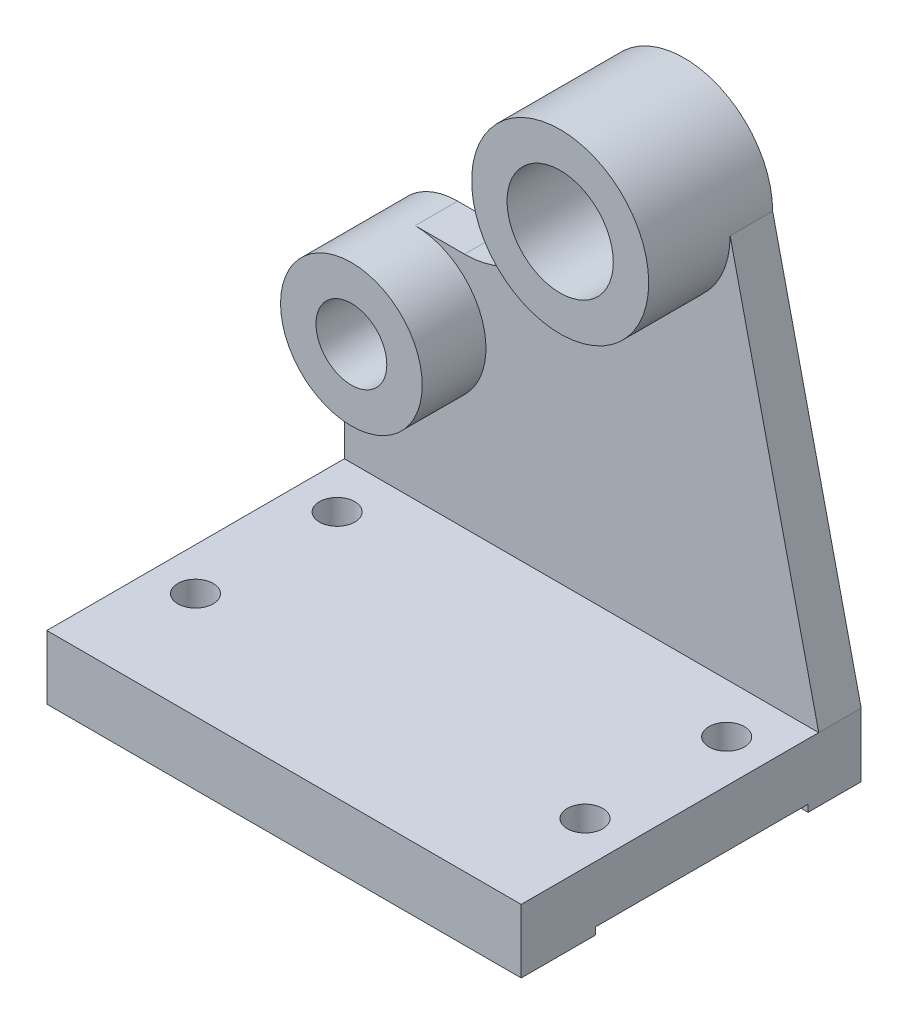
ISO-10303-21;
HEADER;
FILE_DESCRIPTION(('STEP AP214'),'2;1');
FILE_NAME('part.step','',(''),(''),'','','');
FILE_SCHEMA(('AUTOMOTIVE_DESIGN { 1 0 10303 214 1 1 1 1 }'));
ENDSEC;
DATA;
#1=APPLICATION_CONTEXT('core data for automotive mechanical design processes');
#2=APPLICATION_PROTOCOL_DEFINITION('international standard','automotive_design',2000,#1);
#3=PRODUCT_CONTEXT('',#1,'mechanical');
#4=PRODUCT('Part','Part','',(#3));
#5=PRODUCT_RELATED_PRODUCT_CATEGORY('part','',(#4));
#6=PRODUCT_DEFINITION_FORMATION('','',#4);
#7=PRODUCT_DEFINITION_CONTEXT('part definition',#1,'design');
#8=PRODUCT_DEFINITION('design','',#6,#7);
#9=PRODUCT_DEFINITION_SHAPE('','',#8);
#10=(LENGTH_UNIT() NAMED_UNIT(*) SI_UNIT(.MILLI.,.METRE.));
#11=(NAMED_UNIT(*) PLANE_ANGLE_UNIT() SI_UNIT($,.RADIAN.));
#12=(NAMED_UNIT(*) SI_UNIT($,.STERADIAN.) SOLID_ANGLE_UNIT());
#13=UNCERTAINTY_MEASURE_WITH_UNIT(LENGTH_MEASURE(1.E-05),#10,'distance_accuracy_value','');
#14=(GEOMETRIC_REPRESENTATION_CONTEXT(3) GLOBAL_UNCERTAINTY_ASSIGNED_CONTEXT((#13)) GLOBAL_UNIT_ASSIGNED_CONTEXT((#10,
#11,#12)) REPRESENTATION_CONTEXT('',''));
#15=CARTESIAN_POINT('',(0.,0.,0.));
#16=DIRECTION('',(0.,0.,1.));
#17=DIRECTION('',(1.,0.,0.));
#18=AXIS2_PLACEMENT_3D('',#15,#16,#17);
#19=CARTESIAN_POINT('',(-66.9757131025964,0.,96.));
#20=DIRECTION('',(1.,0.,0.));
#21=DIRECTION('',(0.,0.,-1.));
#22=AXIS2_PLACEMENT_3D('',#19,#20,#21);
#23=PLANE('',#22);
#24=DIRECTION('',(0.,1.,0.));
#25=VECTOR('',#24,1.);
#26=CARTESIAN_POINT('',(-66.9757131025964,0.,75.));
#27=LINE('',#26,#25);
#28=CARTESIAN_POINT('',(-66.9757131025963,-9.,75.));
#29=VERTEX_POINT('',#28);
#30=CARTESIAN_POINT('',(-66.9757131025964,-7.00000000000001,75.));
#31=VERTEX_POINT('',#30);
#32=EDGE_CURVE('E227',#29,#31,#27,.T.);
#33=ORIENTED_EDGE('',*,*,#32,.F.);
#34=DIRECTION('',(0.,0.,-1.));
#35=VECTOR('',#34,1.);
#36=CARTESIAN_POINT('',(-66.9757131025964,-9.,96.));
#37=LINE('',#36,#35);
#38=CARTESIAN_POINT('',(-66.9757131025964,-9.,96.));
#39=VERTEX_POINT('',#38);
#40=EDGE_CURVE('E141',#39,#29,#37,.T.);
#41=ORIENTED_EDGE('',*,*,#40,.F.);
#42=DIRECTION('',(0.,-1.,0.));
#43=VECTOR('',#42,1.);
#44=CARTESIAN_POINT('',(-66.9757131025964,0.,96.));
#45=LINE('',#44,#43);
#46=CARTESIAN_POINT('',(-66.9757131025964,9.,96.));
#47=VERTEX_POINT('',#46);
#48=EDGE_CURVE('E109',#47,#39,#45,.T.);
#49=ORIENTED_EDGE('',*,*,#48,.F.);
#50=DIRECTION('',(0.,0.,-1.));
#51=VECTOR('',#50,1.);
#52=CARTESIAN_POINT('',(-66.9757131025964,9.,96.));
#53=LINE('',#52,#51);
#54=CARTESIAN_POINT('',(-66.9757131025964,9.,12.));
#55=VERTEX_POINT('',#54);
#56=EDGE_CURVE('E139',#47,#55,#53,.T.);
#57=ORIENTED_EDGE('',*,*,#56,.T.);
#58=DIRECTION('',(0.,-1.,0.));
#59=VECTOR('',#58,1.);
#60=CARTESIAN_POINT('',(-66.9757131025964,0.,12.));
#61=LINE('',#60,#59);
#62=CARTESIAN_POINT('',(-66.9757131025964,56.,12.));
#63=VERTEX_POINT('',#62);
#64=EDGE_CURVE('E196',#63,#55,#61,.T.);
#65=ORIENTED_EDGE('',*,*,#64,.F.);
#66=DIRECTION('',(0.,0.,-1.));
#67=VECTOR('',#66,1.);
#68=CARTESIAN_POINT('',(-66.9757131025964,56.,12.));
#69=LINE('',#68,#67);
#70=CARTESIAN_POINT('',(-66.9757131025964,56.,0.));
#71=VERTEX_POINT('',#70);
#72=EDGE_CURVE('E160',#63,#71,#69,.T.);
#73=ORIENTED_EDGE('',*,*,#72,.T.);
#74=DIRECTION('',(0.,-1.,0.));
#75=VECTOR('',#74,1.);
#76=CARTESIAN_POINT('',(-66.9757131025964,0.,0.));
#77=LINE('',#76,#75);
#78=CARTESIAN_POINT('',(-66.9757131025964,-9.,0.));
#79=VERTEX_POINT('',#78);
#80=EDGE_CURVE('E131',#71,#79,#77,.T.);
#81=ORIENTED_EDGE('',*,*,#80,.T.);
#82=CARTESIAN_POINT('',(-66.9757131025963,-9.,15.));
#83=VERTEX_POINT('',#82);
#84=EDGE_CURVE('E107',#83,#79,#37,.T.);
#85=ORIENTED_EDGE('',*,*,#84,.F.);
#86=DIRECTION('',(0.,-1.,0.));
#87=VECTOR('',#86,1.);
#88=CARTESIAN_POINT('',(-66.9757131025964,0.,15.));
#89=LINE('',#88,#87);
#90=CARTESIAN_POINT('',(-66.9757131025964,-7.,15.));
#91=VERTEX_POINT('',#90);
#92=EDGE_CURVE('E82',#91,#83,#89,.T.);
#93=ORIENTED_EDGE('',*,*,#92,.F.);
#94=DIRECTION('',(0.,0.,-1.));
#95=VECTOR('',#94,1.);
#96=CARTESIAN_POINT('',(-66.9757131025964,-7.00000000000001,96.));
#97=LINE('',#96,#95);
#98=EDGE_CURVE('E11',#31,#91,#97,.T.);
#99=ORIENTED_EDGE('',*,*,#98,.F.);
#100=EDGE_LOOP('',(#33,#41,#49,#57,#65,#73,#81,#85,#93,#99));
#101=FACE_BOUND('',#100,.T.);
#102=ADVANCED_FACE('F39',(#101),#23,.F.);
#103=CARTESIAN_POINT('',(0.,-9.,96.));
#104=DIRECTION('',(0.,1.,0.));
#105=DIRECTION('',(0.,0.,1.));
#106=AXIS2_PLACEMENT_3D('',#103,#104,#105);
#107=PLANE('',#106);
#108=DIRECTION('',(-1.,0.,0.));
#109=VECTOR('',#108,1.);
#110=CARTESIAN_POINT('',(66.9757251025964,-9.,75.));
#111=LINE('',#110,#109);
#112=CARTESIAN_POINT('',(66.9757131025964,-9.,75.));
#113=VERTEX_POINT('',#112);
#114=EDGE_CURVE('E86',#113,#29,#111,.T.);
#115=ORIENTED_EDGE('',*,*,#114,.F.);
#116=DIRECTION('',(0.,0.,-1.));
#117=VECTOR('',#116,1.);
#118=CARTESIAN_POINT('',(66.9757131025964,-9.,96.));
#119=LINE('',#118,#117);
#120=CARTESIAN_POINT('',(66.9757131025964,-9.,96.));
#121=VERTEX_POINT('',#120);
#122=EDGE_CURVE('E102',#121,#113,#119,.T.);
#123=ORIENTED_EDGE('',*,*,#122,.F.);
#124=DIRECTION('',(1.,0.,0.));
#125=VECTOR('',#124,1.);
#126=CARTESIAN_POINT('',(0.,-9.,96.));
#127=LINE('',#126,#125);
#128=EDGE_CURVE('E104',#39,#121,#127,.T.);
#129=ORIENTED_EDGE('',*,*,#128,.F.);
#130=ORIENTED_EDGE('',*,*,#40,.T.);
#131=EDGE_LOOP('',(#115,#123,#129,#130));
#132=FACE_BOUND('',#131,.T.);
#133=ADVANCED_FACE('F324',(#132),#107,.F.);
#134=CARTESIAN_POINT('',(66.9757131025964,0.,96.));
#135=DIRECTION('',(1.,0.,0.));
#136=DIRECTION('',(0.,0.,-1.));
#137=AXIS2_PLACEMENT_3D('',#134,#135,#136);
#138=PLANE('',#137);
#139=DIRECTION('',(0.,-1.,0.));
#140=VECTOR('',#139,1.);
#141=CARTESIAN_POINT('',(66.9757131025964,0.,75.));
#142=LINE('',#141,#140);
#143=CARTESIAN_POINT('',(66.9757131025964,-7.00000000000001,75.));
#144=VERTEX_POINT('',#143);
#145=EDGE_CURVE('E98',#144,#113,#142,.T.);
#146=ORIENTED_EDGE('',*,*,#145,.F.);
#147=DIRECTION('',(0.,0.,1.));
#148=VECTOR('',#147,1.);
#149=CARTESIAN_POINT('',(66.9757131025964,-7.,0.));
#150=LINE('',#149,#148);
#151=CARTESIAN_POINT('',(66.9757131025964,-7.,15.));
#152=VERTEX_POINT('',#151);
#153=EDGE_CURVE('E100',#152,#144,#150,.T.);
#154=ORIENTED_EDGE('',*,*,#153,.F.);
#155=DIRECTION('',(0.,1.,0.));
#156=VECTOR('',#155,1.);
#157=CARTESIAN_POINT('',(66.9757131025964,0.,15.));
#158=LINE('',#157,#156);
#159=CARTESIAN_POINT('',(66.9757131025964,-9.,15.));
#160=VERTEX_POINT('',#159);
#161=EDGE_CURVE('E81',#160,#152,#158,.T.);
#162=ORIENTED_EDGE('',*,*,#161,.F.);
#163=DIRECTION('',(0.,0.,-1.));
#164=VECTOR('',#163,1.);
#165=CARTESIAN_POINT('',(66.9757131025964,-9.,96.));
#166=LINE('',#165,#164);
#167=CARTESIAN_POINT('',(66.9757131025964,-9.,0.));
#168=VERTEX_POINT('',#167);
#169=EDGE_CURVE('E92',#160,#168,#166,.T.);
#170=ORIENTED_EDGE('',*,*,#169,.T.);
#171=DIRECTION('',(0.,-1.,0.));
#172=VECTOR('',#171,1.);
#173=CARTESIAN_POINT('',(66.9757131025964,0.,0.));
#174=LINE('',#173,#172);
#175=CARTESIAN_POINT('',(66.9757131025964,9.,0.));
#176=VERTEX_POINT('',#175);
#177=EDGE_CURVE('E129',#176,#168,#174,.T.);
#178=ORIENTED_EDGE('',*,*,#177,.F.);
#179=DIRECTION('',(0.,0.,-1.));
#180=VECTOR('',#179,1.);
#181=CARTESIAN_POINT('',(66.9757131025964,9.,12.));
#182=LINE('',#181,#180);
#183=CARTESIAN_POINT('',(66.9757131025964,9.,12.));
#184=VERTEX_POINT('',#183);
#185=EDGE_CURVE('E159',#184,#176,#182,.T.);
#186=ORIENTED_EDGE('',*,*,#185,.F.);
#187=DIRECTION('',(0.,0.,-1.));
#188=VECTOR('',#187,1.);
#189=CARTESIAN_POINT('',(66.9757131025964,9.,96.));
#190=LINE('',#189,#188);
#191=CARTESIAN_POINT('',(66.9757131025964,9.,96.));
#192=VERTEX_POINT('',#191);
#193=EDGE_CURVE('E47',#192,#184,#190,.T.);
#194=ORIENTED_EDGE('',*,*,#193,.F.);
#195=DIRECTION('',(0.,-1.,0.));
#196=VECTOR('',#195,1.);
#197=CARTESIAN_POINT('',(66.9757131025964,0.,96.));
#198=LINE('',#197,#196);
#199=EDGE_CURVE('E133',#192,#121,#198,.T.);
#200=ORIENTED_EDGE('',*,*,#199,.T.);
#201=ORIENTED_EDGE('',*,*,#122,.T.);
#202=EDGE_LOOP('',(#146,#154,#162,#170,#178,#186,#194,#200,#201));
#203=FACE_BOUND('',#202,.T.);
#204=ADVANCED_FACE('F41',(#203),#138,.T.);
#205=CARTESIAN_POINT('',(0.,9.,96.));
#206=DIRECTION('',(0.,1.,0.));
#207=DIRECTION('',(0.,0.,1.));
#208=AXIS2_PLACEMENT_3D('',#205,#206,#207);
#209=PLANE('',#208);
#210=CARTESIAN_POINT('',(-55.,9.,26.));
#211=DIRECTION('',(0.,1.,0.));
#212=DIRECTION('',(0.,0.,1.));
#213=AXIS2_PLACEMENT_3D('',#210,#211,#212);
#214=CIRCLE('',#213,5.);
#215=CARTESIAN_POINT('',(-55.,9.,31.));
#216=VERTEX_POINT('',#215);
#217=EDGE_CURVE('E248',#216,#216,#214,.T.);
#218=ORIENTED_EDGE('',*,*,#217,.F.);
#219=EDGE_LOOP('',(#218));
#220=FACE_BOUND('',#219,.T.);
#221=CARTESIAN_POINT('',(55.,9.,26.));
#222=DIRECTION('',(0.,1.,0.));
#223=DIRECTION('',(0.,0.,1.));
#224=AXIS2_PLACEMENT_3D('',#221,#222,#223);
#225=CIRCLE('',#224,5.);
#226=CARTESIAN_POINT('',(55.,9.,31.));
#227=VERTEX_POINT('',#226);
#228=EDGE_CURVE('E117',#227,#227,#225,.T.);
#229=ORIENTED_EDGE('',*,*,#228,.F.);
#230=EDGE_LOOP('',(#229));
#231=FACE_BOUND('',#230,.T.);
#232=CARTESIAN_POINT('',(55.,9.,66.));
#233=DIRECTION('',(0.,1.,0.));
#234=DIRECTION('',(0.,0.,1.));
#235=AXIS2_PLACEMENT_3D('',#232,#233,#234);
#236=CIRCLE('',#235,5.);
#237=CARTESIAN_POINT('',(55.,9.,71.));
#238=VERTEX_POINT('',#237);
#239=EDGE_CURVE('E243',#238,#238,#236,.T.);
#240=ORIENTED_EDGE('',*,*,#239,.F.);
#241=EDGE_LOOP('',(#240));
#242=FACE_BOUND('',#241,.T.);
#243=CARTESIAN_POINT('',(-55.,9.,66.));
#244=DIRECTION('',(0.,1.,0.));
#245=DIRECTION('',(0.,0.,1.));
#246=AXIS2_PLACEMENT_3D('',#243,#244,#245);
#247=CIRCLE('',#246,5.);
#248=CARTESIAN_POINT('',(-55.,9.,71.));
#249=VERTEX_POINT('',#248);
#250=EDGE_CURVE('E241',#249,#249,#247,.T.);
#251=ORIENTED_EDGE('',*,*,#250,.F.);
#252=EDGE_LOOP('',(#251));
#253=FACE_BOUND('',#252,.T.);
#254=DIRECTION('',(1.,0.,0.));
#255=VECTOR('',#254,1.);
#256=CARTESIAN_POINT('',(0.,9.,12.));
#257=LINE('',#256,#255);
#258=EDGE_CURVE('E194',#55,#184,#257,.T.);
#259=ORIENTED_EDGE('',*,*,#258,.F.);
#260=ORIENTED_EDGE('',*,*,#56,.F.);
#261=DIRECTION('',(1.,0.,0.));
#262=VECTOR('',#261,1.);
#263=CARTESIAN_POINT('',(0.,9.,96.));
#264=LINE('',#263,#262);
#265=EDGE_CURVE('E136',#47,#192,#264,.T.);
#266=ORIENTED_EDGE('',*,*,#265,.T.);
#267=ORIENTED_EDGE('',*,*,#193,.T.);
#268=EDGE_LOOP('',(#259,#260,#266,#267));
#269=FACE_BOUND('',#268,.T.);
#270=ADVANCED_FACE('F385',(#220,#231,#242,#253,#269),#209,.T.);
#271=ORIENTED_EDGE('',*,*,#169,.F.);
#272=DIRECTION('',(-1.,0.,0.));
#273=VECTOR('',#272,1.);
#274=CARTESIAN_POINT('',(66.9757251025964,-9.,15.));
#275=LINE('',#274,#273);
#276=EDGE_CURVE('E77',#160,#83,#275,.T.);
#277=ORIENTED_EDGE('',*,*,#276,.T.);
#278=ORIENTED_EDGE('',*,*,#84,.T.);
#279=DIRECTION('',(1.,0.,0.));
#280=VECTOR('',#279,1.);
#281=CARTESIAN_POINT('',(0.,-9.,0.));
#282=LINE('',#281,#280);
#283=EDGE_CURVE('E105',#79,#168,#282,.T.);
#284=ORIENTED_EDGE('',*,*,#283,.T.);
#285=EDGE_LOOP('',(#271,#277,#278,#284));
#286=FACE_BOUND('',#285,.T.);
#287=ADVANCED_FACE('F99',(#286),#107,.F.);
#288=CARTESIAN_POINT('',(0.,0.,96.));
#289=DIRECTION('',(0.,0.,1.));
#290=DIRECTION('',(1.,0.,0.));
#291=AXIS2_PLACEMENT_3D('',#288,#289,#290);
#292=PLANE('',#291);
#293=ORIENTED_EDGE('',*,*,#199,.F.);
#294=ORIENTED_EDGE('',*,*,#265,.F.);
#295=ORIENTED_EDGE('',*,*,#48,.T.);
#296=ORIENTED_EDGE('',*,*,#128,.T.);
#297=EDGE_LOOP('',(#293,#294,#295,#296));
#298=FACE_BOUND('',#297,.T.);
#299=ADVANCED_FACE('F328',(#298),#292,.T.);
#300=CARTESIAN_POINT('',(0.,0.,0.));
#301=DIRECTION('',(0.,0.,1.));
#302=DIRECTION('',(1.,0.,0.));
#303=AXIS2_PLACEMENT_3D('',#300,#301,#302);
#304=PLANE('',#303);
#305=ORIENTED_EDGE('',*,*,#177,.T.);
#306=ORIENTED_EDGE('',*,*,#283,.F.);
#307=ORIENTED_EDGE('',*,*,#80,.F.);
#308=CARTESIAN_POINT('',(-46.9757131025964,56.,0.));
#309=DIRECTION('',(0.,0.,1.));
#310=DIRECTION('',(1.,0.,0.));
#311=AXIS2_PLACEMENT_3D('',#308,#309,#310);
#312=CIRCLE('',#311,20.);
#313=CARTESIAN_POINT('',(-46.9757131025964,76.,0.));
#314=VERTEX_POINT('',#313);
#315=EDGE_CURVE('E207',#314,#71,#312,.T.);
#316=ORIENTED_EDGE('',*,*,#315,.F.);
#317=DIRECTION('',(1.,0.,0.));
#318=VECTOR('',#317,1.);
#319=CARTESIAN_POINT('',(0.,76.,0.));
#320=LINE('',#319,#318);
#321=CARTESIAN_POINT('',(-33.0242868974038,76.,0.));
#322=VERTEX_POINT('',#321);
#323=EDGE_CURVE('E179',#314,#322,#320,.T.);
#324=ORIENTED_EDGE('',*,*,#323,.T.);
#325=CARTESIAN_POINT('',(-33.0242868974036,101.,0.));
#326=DIRECTION('',(0.,0.,1.));
#327=DIRECTION('',(1.,0.,0.));
#328=AXIS2_PLACEMENT_3D('',#325,#326,#327);
#329=CIRCLE('',#328,25.);
#330=CARTESIAN_POINT('',(-8.02428689740358,101.,0.));
#331=VERTEX_POINT('',#330);
#332=EDGE_CURVE('E181',#322,#331,#329,.T.);
#333=ORIENTED_EDGE('',*,*,#332,.T.);
#334=DIRECTION('',(0.,-1.,0.));
#335=VECTOR('',#334,1.);
#336=CARTESIAN_POINT('',(-8.02428689740358,0.,0.));
#337=LINE('',#336,#335);
#338=CARTESIAN_POINT('',(-8.02428689740358,118.,0.));
#339=VERTEX_POINT('',#338);
#340=EDGE_CURVE('E172',#339,#331,#337,.T.);
#341=ORIENTED_EDGE('',*,*,#340,.F.);
#342=CARTESIAN_POINT('',(16.9757131025964,118.,0.));
#343=DIRECTION('',(0.,0.,1.));
#344=DIRECTION('',(1.,0.,0.));
#345=AXIS2_PLACEMENT_3D('',#342,#343,#344);
#346=CIRCLE('',#345,25.);
#347=CARTESIAN_POINT('',(41.9757131025964,118.,0.));
#348=VERTEX_POINT('',#347);
#349=EDGE_CURVE('E222',#348,#339,#346,.T.);
#350=ORIENTED_EDGE('',*,*,#349,.F.);
#351=DIRECTION('',(-0.223553151430422,0.974691740236639,0.));
#352=VECTOR('',#351,1.);
#353=CARTESIAN_POINT('',(65.589592785219,15.0434845837658,0.));
#354=LINE('',#353,#352);
#355=EDGE_CURVE('E180',#176,#348,#354,.T.);
#356=ORIENTED_EDGE('',*,*,#355,.F.);
#357=EDGE_LOOP('',(#305,#306,#307,#316,#324,#333,#341,#350,#356));
#358=FACE_BOUND('',#357,.T.);
#359=CARTESIAN_POINT('',(-46.9757131025964,56.,0.));
#360=DIRECTION('',(0.,0.,1.));
#361=DIRECTION('',(1.,0.,0.));
#362=AXIS2_PLACEMENT_3D('',#359,#360,#361);
#363=CIRCLE('',#362,10.);
#364=CARTESIAN_POINT('',(-36.9757131025964,56.,0.));
#365=VERTEX_POINT('',#364);
#366=EDGE_CURVE('E213',#365,#365,#363,.T.);
#367=ORIENTED_EDGE('',*,*,#366,.T.);
#368=EDGE_LOOP('',(#367));
#369=FACE_BOUND('',#368,.T.);
#370=CARTESIAN_POINT('',(16.9757131025964,118.,0.));
#371=DIRECTION('',(0.,0.,1.));
#372=DIRECTION('',(1.,0.,0.));
#373=AXIS2_PLACEMENT_3D('',#370,#371,#372);
#374=CIRCLE('',#373,15.);
#375=CARTESIAN_POINT('',(31.9757131025964,118.,0.));
#376=VERTEX_POINT('',#375);
#377=EDGE_CURVE('E223',#376,#376,#374,.T.);
#378=ORIENTED_EDGE('',*,*,#377,.T.);
#379=EDGE_LOOP('',(#378));
#380=FACE_BOUND('',#379,.T.);
#381=ADVANCED_FACE('F343',(#358,#369,#380),#304,.F.);
#382=CARTESIAN_POINT('',(-33.0242868974036,101.,12.));
#383=DIRECTION('',(0.,0.,-1.));
#384=DIRECTION('',(-1.,0.,0.));
#385=AXIS2_PLACEMENT_3D('',#382,#383,#384);
#386=CYLINDRICAL_SURFACE('',#385,25.);
#387=ORIENTED_EDGE('',*,*,#332,.F.);
#388=DIRECTION('',(0.,0.,-1.));
#389=VECTOR('',#388,1.);
#390=CARTESIAN_POINT('',(-33.0242868974038,76.,12.));
#391=LINE('',#390,#389);
#392=CARTESIAN_POINT('',(-33.0242868974038,76.,12.));
#393=VERTEX_POINT('',#392);
#394=EDGE_CURVE('E135',#393,#322,#391,.T.);
#395=ORIENTED_EDGE('',*,*,#394,.F.);
#396=CARTESIAN_POINT('',(-33.0242868974036,101.,12.));
#397=DIRECTION('',(0.,0.,1.));
#398=DIRECTION('',(1.,0.,0.));
#399=AXIS2_PLACEMENT_3D('',#396,#397,#398);
#400=CIRCLE('',#399,25.);
#401=CARTESIAN_POINT('',(-8.02428689740358,101.,12.));
#402=VERTEX_POINT('',#401);
#403=EDGE_CURVE('E176',#393,#402,#400,.T.);
#404=ORIENTED_EDGE('',*,*,#403,.T.);
#405=DIRECTION('',(0.,0.,-1.));
#406=VECTOR('',#405,1.);
#407=CARTESIAN_POINT('',(-8.02428689740358,101.,12.));
#408=LINE('',#407,#406);
#409=EDGE_CURVE('E166',#402,#331,#408,.T.);
#410=ORIENTED_EDGE('',*,*,#409,.T.);
#411=EDGE_LOOP('',(#387,#395,#404,#410));
#412=FACE_BOUND('',#411,.T.);
#413=ADVANCED_FACE('F362',(#412),#386,.F.);
#414=CARTESIAN_POINT('',(0.,76.,12.));
#415=DIRECTION('',(0.,1.,0.));
#416=DIRECTION('',(0.,0.,1.));
#417=AXIS2_PLACEMENT_3D('',#414,#415,#416);
#418=PLANE('',#417);
#419=ORIENTED_EDGE('',*,*,#323,.F.);
#420=DIRECTION('',(0.,0.,-1.));
#421=VECTOR('',#420,1.);
#422=CARTESIAN_POINT('',(-46.9757131025964,76.,12.));
#423=LINE('',#422,#421);
#424=CARTESIAN_POINT('',(-46.9757131025964,76.,12.));
#425=VERTEX_POINT('',#424);
#426=EDGE_CURVE('E152',#425,#314,#423,.T.);
#427=ORIENTED_EDGE('',*,*,#426,.F.);
#428=DIRECTION('',(1.,0.,0.));
#429=VECTOR('',#428,1.);
#430=CARTESIAN_POINT('',(0.,76.,12.));
#431=LINE('',#430,#429);
#432=EDGE_CURVE('E204',#425,#393,#431,.T.);
#433=ORIENTED_EDGE('',*,*,#432,.T.);
#434=ORIENTED_EDGE('',*,*,#394,.T.);
#435=EDGE_LOOP('',(#419,#427,#433,#434));
#436=FACE_BOUND('',#435,.T.);
#437=ADVANCED_FACE('F365',(#436),#418,.T.);
#438=CARTESIAN_POINT('',(65.589592785219,15.0434845837658,12.));
#439=DIRECTION('',(-0.974691740236639,-0.223553151430422,0.));
#440=DIRECTION('',(0.223553151430422,-0.974691740236639,0.));
#441=AXIS2_PLACEMENT_3D('',#438,#439,#440);
#442=PLANE('',#441);
#443=ORIENTED_EDGE('',*,*,#355,.T.);
#444=DIRECTION('',(0.,0.,-1.));
#445=VECTOR('',#444,1.);
#446=CARTESIAN_POINT('',(41.9757131025964,118.,12.));
#447=LINE('',#446,#445);
#448=CARTESIAN_POINT('',(41.9757131025964,118.,12.));
#449=VERTEX_POINT('',#448);
#450=EDGE_CURVE('E162',#449,#348,#447,.T.);
#451=ORIENTED_EDGE('',*,*,#450,.F.);
#452=DIRECTION('',(-0.223553151430422,0.974691740236639,0.));
#453=VECTOR('',#452,1.);
#454=CARTESIAN_POINT('',(65.589592785219,15.0434845837658,12.));
#455=LINE('',#454,#453);
#456=EDGE_CURVE('E195',#184,#449,#455,.T.);
#457=ORIENTED_EDGE('',*,*,#456,.F.);
#458=ORIENTED_EDGE('',*,*,#185,.T.);
#459=EDGE_LOOP('',(#443,#451,#457,#458));
#460=FACE_BOUND('',#459,.T.);
#461=ADVANCED_FACE('F348',(#460),#442,.F.);
#462=CARTESIAN_POINT('',(-8.02428689740358,0.,12.));
#463=DIRECTION('',(1.,0.,0.));
#464=DIRECTION('',(0.,0.,-1.));
#465=AXIS2_PLACEMENT_3D('',#462,#463,#464);
#466=PLANE('',#465);
#467=ORIENTED_EDGE('',*,*,#340,.T.);
#468=ORIENTED_EDGE('',*,*,#409,.F.);
#469=DIRECTION('',(0.,-1.,0.));
#470=VECTOR('',#469,1.);
#471=CARTESIAN_POINT('',(-8.02428689740358,0.,12.));
#472=LINE('',#471,#470);
#473=CARTESIAN_POINT('',(-8.02428689740358,118.,12.));
#474=VERTEX_POINT('',#473);
#475=EDGE_CURVE('E175',#474,#402,#472,.T.);
#476=ORIENTED_EDGE('',*,*,#475,.F.);
#477=DIRECTION('',(0.,0.,-1.));
#478=VECTOR('',#477,1.);
#479=CARTESIAN_POINT('',(-8.02428689740358,118.,12.));
#480=LINE('',#479,#478);
#481=EDGE_CURVE('E167',#474,#339,#480,.T.);
#482=ORIENTED_EDGE('',*,*,#481,.T.);
#483=EDGE_LOOP('',(#467,#468,#476,#482));
#484=FACE_BOUND('',#483,.T.);
#485=ADVANCED_FACE('F357',(#484),#466,.F.);
#486=CARTESIAN_POINT('',(0.,0.,12.));
#487=DIRECTION('',(0.,0.,1.));
#488=DIRECTION('',(1.,0.,0.));
#489=AXIS2_PLACEMENT_3D('',#486,#487,#488);
#490=PLANE('',#489);
#491=ORIENTED_EDGE('',*,*,#403,.F.);
#492=ORIENTED_EDGE('',*,*,#432,.F.);
#493=CARTESIAN_POINT('',(-46.9757131025964,56.,12.));
#494=DIRECTION('',(0.,0.,1.));
#495=DIRECTION('',(1.,0.,0.));
#496=AXIS2_PLACEMENT_3D('',#493,#494,#495);
#497=CIRCLE('',#496,20.);
#498=EDGE_CURVE('E203',#63,#425,#497,.T.);
#499=ORIENTED_EDGE('',*,*,#498,.F.);
#500=ORIENTED_EDGE('',*,*,#64,.T.);
#501=ORIENTED_EDGE('',*,*,#258,.T.);
#502=ORIENTED_EDGE('',*,*,#456,.T.);
#503=CARTESIAN_POINT('',(16.9757131025964,118.,12.));
#504=DIRECTION('',(0.,0.,1.));
#505=DIRECTION('',(1.,0.,0.));
#506=AXIS2_PLACEMENT_3D('',#503,#504,#505);
#507=CIRCLE('',#506,25.);
#508=EDGE_CURVE('E188',#474,#449,#507,.T.);
#509=ORIENTED_EDGE('',*,*,#508,.F.);
#510=ORIENTED_EDGE('',*,*,#475,.T.);
#511=EDGE_LOOP('',(#491,#492,#499,#500,#501,#502,#509,#510));
#512=FACE_BOUND('',#511,.T.);
#513=ADVANCED_FACE('F333',(#512),#490,.T.);
#514=CARTESIAN_POINT('',(-46.9757131025964,56.,30.));
#515=DIRECTION('',(0.,0.,-1.));
#516=DIRECTION('',(-1.,0.,0.));
#517=AXIS2_PLACEMENT_3D('',#514,#515,#516);
#518=CYLINDRICAL_SURFACE('',#517,10.);
#519=CARTESIAN_POINT('',(-46.9757131025964,56.,30.));
#520=DIRECTION('',(0.,0.,1.));
#521=DIRECTION('',(1.,0.,0.));
#522=AXIS2_PLACEMENT_3D('',#519,#520,#521);
#523=CIRCLE('',#522,10.);
#524=CARTESIAN_POINT('',(-36.9757131025964,56.,30.));
#525=VERTEX_POINT('',#524);
#526=EDGE_CURVE('E215',#525,#525,#523,.T.);
#527=ORIENTED_EDGE('',*,*,#526,.T.);
#528=EDGE_LOOP('',(#527));
#529=FACE_BOUND('',#528,.T.);
#530=ORIENTED_EDGE('',*,*,#366,.F.);
#531=EDGE_LOOP('',(#530));
#532=FACE_BOUND('',#531,.T.);
#533=ADVANCED_FACE('F428',(#529,#532),#518,.F.);
#534=CARTESIAN_POINT('',(-46.9757131025964,56.,30.));
#535=DIRECTION('',(0.,0.,-1.));
#536=DIRECTION('',(-1.,0.,0.));
#537=AXIS2_PLACEMENT_3D('',#534,#535,#536);
#538=CYLINDRICAL_SURFACE('',#537,20.);
#539=ORIENTED_EDGE('',*,*,#72,.F.);
#540=ORIENTED_EDGE('',*,*,#498,.T.);
#541=ORIENTED_EDGE('',*,*,#426,.T.);
#542=ORIENTED_EDGE('',*,*,#315,.T.);
#543=EDGE_LOOP('',(#539,#540,#541,#542));
#544=FACE_BOUND('',#543,.T.);
#545=CARTESIAN_POINT('',(-46.9757131025964,56.,30.));
#546=DIRECTION('',(0.,0.,1.));
#547=DIRECTION('',(1.,0.,0.));
#548=AXIS2_PLACEMENT_3D('',#545,#546,#547);
#549=CIRCLE('',#548,20.);
#550=CARTESIAN_POINT('',(-26.9757131025964,56.,30.));
#551=VERTEX_POINT('',#550);
#552=EDGE_CURVE('E186',#551,#551,#549,.T.);
#553=ORIENTED_EDGE('',*,*,#552,.F.);
#554=EDGE_LOOP('',(#553));
#555=FACE_BOUND('',#554,.T.);
#556=ADVANCED_FACE('F339',(#544,#555),#538,.T.);
#557=CARTESIAN_POINT('',(0.,0.,30.));
#558=DIRECTION('',(0.,0.,1.));
#559=DIRECTION('',(1.,0.,0.));
#560=AXIS2_PLACEMENT_3D('',#557,#558,#559);
#561=PLANE('',#560);
#562=ORIENTED_EDGE('',*,*,#526,.F.);
#563=EDGE_LOOP('',(#562));
#564=FACE_BOUND('',#563,.T.);
#565=ORIENTED_EDGE('',*,*,#552,.T.);
#566=EDGE_LOOP('',(#565));
#567=FACE_BOUND('',#566,.T.);
#568=ADVANCED_FACE('F423',(#564,#567),#561,.T.);
#569=CARTESIAN_POINT('',(16.9757131025964,118.,35.));
#570=DIRECTION('',(0.,0.,-1.));
#571=DIRECTION('',(-1.,0.,0.));
#572=AXIS2_PLACEMENT_3D('',#569,#570,#571);
#573=CYLINDRICAL_SURFACE('',#572,15.);
#574=CARTESIAN_POINT('',(16.9757131025964,118.,35.));
#575=DIRECTION('',(0.,0.,1.));
#576=DIRECTION('',(1.,0.,0.));
#577=AXIS2_PLACEMENT_3D('',#574,#575,#576);
#578=CIRCLE('',#577,15.);
#579=CARTESIAN_POINT('',(31.9757131025964,118.,35.));
#580=VERTEX_POINT('',#579);
#581=EDGE_CURVE('E221',#580,#580,#578,.T.);
#582=ORIENTED_EDGE('',*,*,#581,.T.);
#583=EDGE_LOOP('',(#582));
#584=FACE_BOUND('',#583,.T.);
#585=ORIENTED_EDGE('',*,*,#377,.F.);
#586=EDGE_LOOP('',(#585));
#587=FACE_BOUND('',#586,.T.);
#588=ADVANCED_FACE('F416',(#584,#587),#573,.F.);
#589=CARTESIAN_POINT('',(16.9757131025964,118.,35.));
#590=DIRECTION('',(0.,0.,-1.));
#591=DIRECTION('',(-1.,0.,0.));
#592=AXIS2_PLACEMENT_3D('',#589,#590,#591);
#593=CYLINDRICAL_SURFACE('',#592,25.);
#594=ORIENTED_EDGE('',*,*,#481,.F.);
#595=ORIENTED_EDGE('',*,*,#508,.T.);
#596=ORIENTED_EDGE('',*,*,#450,.T.);
#597=ORIENTED_EDGE('',*,*,#349,.T.);
#598=EDGE_LOOP('',(#594,#595,#596,#597));
#599=FACE_BOUND('',#598,.T.);
#600=CARTESIAN_POINT('',(16.9757131025964,118.,35.));
#601=DIRECTION('',(0.,0.,1.));
#602=DIRECTION('',(1.,0.,0.));
#603=AXIS2_PLACEMENT_3D('',#600,#601,#602);
#604=CIRCLE('',#603,25.);
#605=CARTESIAN_POINT('',(41.9757131025964,118.,35.));
#606=VERTEX_POINT('',#605);
#607=EDGE_CURVE('E216',#606,#606,#604,.T.);
#608=ORIENTED_EDGE('',*,*,#607,.F.);
#609=EDGE_LOOP('',(#608));
#610=FACE_BOUND('',#609,.T.);
#611=ADVANCED_FACE('F353',(#599,#610),#593,.T.);
#612=CARTESIAN_POINT('',(0.,0.,35.));
#613=DIRECTION('',(0.,0.,1.));
#614=DIRECTION('',(1.,0.,0.));
#615=AXIS2_PLACEMENT_3D('',#612,#613,#614);
#616=PLANE('',#615);
#617=ORIENTED_EDGE('',*,*,#581,.F.);
#618=EDGE_LOOP('',(#617));
#619=FACE_BOUND('',#618,.T.);
#620=ORIENTED_EDGE('',*,*,#607,.T.);
#621=EDGE_LOOP('',(#620));
#622=FACE_BOUND('',#621,.T.);
#623=ADVANCED_FACE('F265',(#619,#622),#616,.T.);
#624=CARTESIAN_POINT('',(66.9757251025964,-7.,0.));
#625=DIRECTION('',(0.,-1.,0.));
#626=DIRECTION('',(0.,0.,-1.));
#627=AXIS2_PLACEMENT_3D('',#624,#625,#626);
#628=PLANE('',#627);
#629=CARTESIAN_POINT('',(-55.,-7.00000000000001,26.));
#630=DIRECTION('',(0.,-1.,0.));
#631=DIRECTION('',(0.,0.,-1.));
#632=AXIS2_PLACEMENT_3D('',#629,#630,#631);
#633=CIRCLE('',#632,5.);
#634=CARTESIAN_POINT('',(-55.,-7.00000000000001,21.));
#635=VERTEX_POINT('',#634);
#636=EDGE_CURVE('E43',#635,#635,#633,.T.);
#637=ORIENTED_EDGE('',*,*,#636,.F.);
#638=EDGE_LOOP('',(#637));
#639=FACE_BOUND('',#638,.T.);
#640=CARTESIAN_POINT('',(55.,-7.00000000000001,26.));
#641=DIRECTION('',(0.,-1.,0.));
#642=DIRECTION('',(0.,0.,-1.));
#643=AXIS2_PLACEMENT_3D('',#640,#641,#642);
#644=CIRCLE('',#643,5.);
#645=CARTESIAN_POINT('',(55.,-7.00000000000001,21.));
#646=VERTEX_POINT('',#645);
#647=EDGE_CURVE('E119',#646,#646,#644,.T.);
#648=ORIENTED_EDGE('',*,*,#647,.F.);
#649=EDGE_LOOP('',(#648));
#650=FACE_BOUND('',#649,.T.);
#651=CARTESIAN_POINT('',(55.,-7.00000000000001,66.));
#652=DIRECTION('',(0.,-1.,0.));
#653=DIRECTION('',(0.,0.,-1.));
#654=AXIS2_PLACEMENT_3D('',#651,#652,#653);
#655=CIRCLE('',#654,5.);
#656=CARTESIAN_POINT('',(55.,-7.00000000000001,61.));
#657=VERTEX_POINT('',#656);
#658=EDGE_CURVE('E120',#657,#657,#655,.T.);
#659=ORIENTED_EDGE('',*,*,#658,.F.);
#660=EDGE_LOOP('',(#659));
#661=FACE_BOUND('',#660,.T.);
#662=CARTESIAN_POINT('',(-55.,-7.00000000000001,66.));
#663=DIRECTION('',(0.,-1.,0.));
#664=DIRECTION('',(0.,0.,-1.));
#665=AXIS2_PLACEMENT_3D('',#662,#663,#664);
#666=CIRCLE('',#665,5.);
#667=CARTESIAN_POINT('',(-55.,-7.00000000000001,61.));
#668=VERTEX_POINT('',#667);
#669=EDGE_CURVE('E111',#668,#668,#666,.T.);
#670=ORIENTED_EDGE('',*,*,#669,.F.);
#671=EDGE_LOOP('',(#670));
#672=FACE_BOUND('',#671,.T.);
#673=ORIENTED_EDGE('',*,*,#98,.T.);
#674=DIRECTION('',(-1.,0.,0.));
#675=VECTOR('',#674,1.);
#676=CARTESIAN_POINT('',(66.9757251025964,-7.,15.));
#677=LINE('',#676,#675);
#678=EDGE_CURVE('E59',#152,#91,#677,.T.);
#679=ORIENTED_EDGE('',*,*,#678,.F.);
#680=ORIENTED_EDGE('',*,*,#153,.T.);
#681=DIRECTION('',(-1.,0.,0.));
#682=VECTOR('',#681,1.);
#683=CARTESIAN_POINT('',(66.9757251025964,-7.00000000000001,75.));
#684=LINE('',#683,#682);
#685=EDGE_CURVE('E234',#144,#31,#684,.T.);
#686=ORIENTED_EDGE('',*,*,#685,.T.);
#687=EDGE_LOOP('',(#673,#679,#680,#686));
#688=FACE_BOUND('',#687,.T.);
#689=ADVANCED_FACE('F256',(#639,#650,#661,#672,#688),#628,.T.);
#690=CARTESIAN_POINT('',(66.9757251025964,0.,75.));
#691=DIRECTION('',(0.,0.,-1.));
#692=DIRECTION('',(-1.,0.,0.));
#693=AXIS2_PLACEMENT_3D('',#690,#691,#692);
#694=PLANE('',#693);
#695=ORIENTED_EDGE('',*,*,#32,.T.);
#696=ORIENTED_EDGE('',*,*,#685,.F.);
#697=ORIENTED_EDGE('',*,*,#145,.T.);
#698=ORIENTED_EDGE('',*,*,#114,.T.);
#699=EDGE_LOOP('',(#695,#696,#697,#698));
#700=FACE_BOUND('',#699,.T.);
#701=ADVANCED_FACE('F261',(#700),#694,.T.);
#702=CARTESIAN_POINT('',(66.9757251025964,0.,15.));
#703=DIRECTION('',(0.,0.,1.));
#704=DIRECTION('',(1.,0.,0.));
#705=AXIS2_PLACEMENT_3D('',#702,#703,#704);
#706=PLANE('',#705);
#707=ORIENTED_EDGE('',*,*,#92,.T.);
#708=ORIENTED_EDGE('',*,*,#276,.F.);
#709=ORIENTED_EDGE('',*,*,#161,.T.);
#710=ORIENTED_EDGE('',*,*,#678,.T.);
#711=EDGE_LOOP('',(#707,#708,#709,#710));
#712=FACE_BOUND('',#711,.T.);
#713=ADVANCED_FACE('F79',(#712),#706,.T.);
#714=CARTESIAN_POINT('',(-55.,-26.,66.));
#715=DIRECTION('',(0.,1.,0.));
#716=DIRECTION('',(0.,0.,1.));
#717=AXIS2_PLACEMENT_3D('',#714,#715,#716);
#718=CYLINDRICAL_SURFACE('',#717,5.);
#719=ORIENTED_EDGE('',*,*,#669,.T.);
#720=EDGE_LOOP('',(#719));
#721=FACE_BOUND('',#720,.T.);
#722=ORIENTED_EDGE('',*,*,#250,.T.);
#723=EDGE_LOOP('',(#722));
#724=FACE_BOUND('',#723,.T.);
#725=ADVANCED_FACE('F400',(#721,#724),#718,.F.);
#726=CARTESIAN_POINT('',(55.,-26.,66.));
#727=DIRECTION('',(0.,1.,0.));
#728=DIRECTION('',(0.,0.,1.));
#729=AXIS2_PLACEMENT_3D('',#726,#727,#728);
#730=CYLINDRICAL_SURFACE('',#729,5.);
#731=ORIENTED_EDGE('',*,*,#658,.T.);
#732=EDGE_LOOP('',(#731));
#733=FACE_BOUND('',#732,.T.);
#734=ORIENTED_EDGE('',*,*,#239,.T.);
#735=EDGE_LOOP('',(#734));
#736=FACE_BOUND('',#735,.T.);
#737=ADVANCED_FACE('F398',(#733,#736),#730,.F.);
#738=CARTESIAN_POINT('',(55.,-26.,26.));
#739=DIRECTION('',(0.,1.,0.));
#740=DIRECTION('',(0.,0.,1.));
#741=AXIS2_PLACEMENT_3D('',#738,#739,#740);
#742=CYLINDRICAL_SURFACE('',#741,5.);
#743=ORIENTED_EDGE('',*,*,#647,.T.);
#744=EDGE_LOOP('',(#743));
#745=FACE_BOUND('',#744,.T.);
#746=ORIENTED_EDGE('',*,*,#228,.T.);
#747=EDGE_LOOP('',(#746));
#748=FACE_BOUND('',#747,.T.);
#749=ADVANCED_FACE('F406',(#745,#748),#742,.F.);
#750=CARTESIAN_POINT('',(-55.,-26.,26.));
#751=DIRECTION('',(0.,1.,0.));
#752=DIRECTION('',(0.,0.,1.));
#753=AXIS2_PLACEMENT_3D('',#750,#751,#752);
#754=CYLINDRICAL_SURFACE('',#753,5.);
#755=ORIENTED_EDGE('',*,*,#636,.T.);
#756=EDGE_LOOP('',(#755));
#757=FACE_BOUND('',#756,.T.);
#758=ORIENTED_EDGE('',*,*,#217,.T.);
#759=EDGE_LOOP('',(#758));
#760=FACE_BOUND('',#759,.T.);
#761=ADVANCED_FACE('F258',(#757,#760),#754,.F.);
#762=CLOSED_SHELL('',(#102,#133,#204,#270,#287,#299,#381,#413,#437,#461,#485,#513,#533,#556,
#568,#588,#611,#623,#689,#701,#713,#725,#737,#749,#761));
#763=MANIFOLD_SOLID_BREP('B2',#762);
#764=ADVANCED_BREP_SHAPE_REPRESENTATION('',(#18,#763),#14);
#765=SHAPE_DEFINITION_REPRESENTATION(#9,#764);
ENDSEC;
END-ISO-10303-21;
